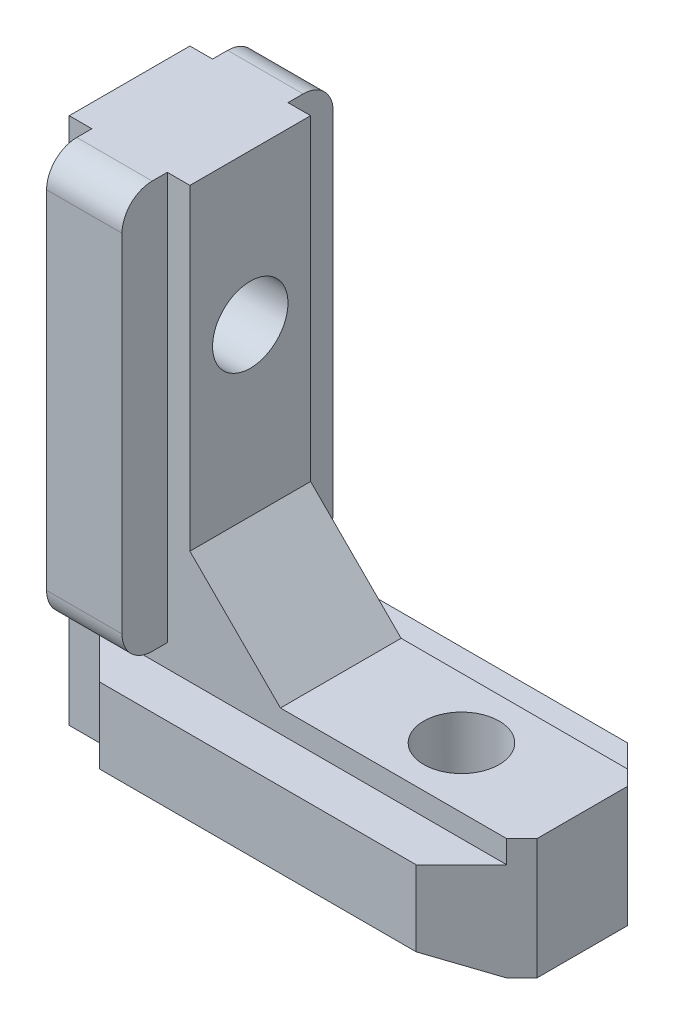
ISO-10303-21;
HEADER;
FILE_DESCRIPTION(('STEP AP214'),'2;1');
FILE_NAME('part.step','',(''),(''),'','','');
FILE_SCHEMA(('AUTOMOTIVE_DESIGN { 1 0 10303 214 1 1 1 1 }'));
ENDSEC;
DATA;
#1=APPLICATION_CONTEXT('core data for automotive mechanical design processes');
#2=APPLICATION_PROTOCOL_DEFINITION('international standard','automotive_design',2000,#1);
#3=PRODUCT_CONTEXT('',#1,'mechanical');
#4=PRODUCT('Part','Part','',(#3));
#5=PRODUCT_RELATED_PRODUCT_CATEGORY('part','',(#4));
#6=PRODUCT_DEFINITION_FORMATION('','',#4);
#7=PRODUCT_DEFINITION_CONTEXT('part definition',#1,'design');
#8=PRODUCT_DEFINITION('design','',#6,#7);
#9=PRODUCT_DEFINITION_SHAPE('','',#8);
#10=(LENGTH_UNIT() NAMED_UNIT(*) SI_UNIT(.MILLI.,.METRE.));
#11=(NAMED_UNIT(*) PLANE_ANGLE_UNIT() SI_UNIT($,.RADIAN.));
#12=(NAMED_UNIT(*) SI_UNIT($,.STERADIAN.) SOLID_ANGLE_UNIT());
#13=UNCERTAINTY_MEASURE_WITH_UNIT(LENGTH_MEASURE(1.E-05),#10,'distance_accuracy_value','');
#14=(GEOMETRIC_REPRESENTATION_CONTEXT(3) GLOBAL_UNCERTAINTY_ASSIGNED_CONTEXT((#13)) GLOBAL_UNIT_ASSIGNED_CONTEXT((#10,
#11,#12)) REPRESENTATION_CONTEXT('',''));
#15=CARTESIAN_POINT('',(0.,0.,0.));
#16=DIRECTION('',(0.,0.,1.));
#17=DIRECTION('',(1.,0.,0.));
#18=AXIS2_PLACEMENT_3D('',#15,#16,#17);
#19=CARTESIAN_POINT('',(30.,0.,4.));
#20=DIRECTION('',(0.,1.,0.));
#21=DIRECTION('',(-1.,0.,0.));
#22=AXIS2_PLACEMENT_3D('',#19,#20,#21);
#23=PLANE('',#22);
#24=CARTESIAN_POINT('',(22.,0.,0.));
#25=DIRECTION('',(0.,-1.,0.));
#26=DIRECTION('',(1.,0.,0.));
#27=AXIS2_PLACEMENT_3D('',#24,#25,#26);
#28=CIRCLE('',#27,2.5);
#29=CARTESIAN_POINT('',(24.5,0.,0.));
#30=VERTEX_POINT('',#29);
#31=EDGE_CURVE('E295',#30,#30,#28,.T.);
#32=ORIENTED_EDGE('',*,*,#31,.F.);
#33=EDGE_LOOP('',(#32));
#34=FACE_BOUND('',#33,.T.);
#35=DIRECTION('',(1.,0.,0.));
#36=VECTOR('',#35,1.);
#37=CARTESIAN_POINT('',(0.999999999999997,0.,-4.));
#38=LINE('',#37,#36);
#39=CARTESIAN_POINT('',(2.00000000000004,0.,-4.));
#40=VERTEX_POINT('',#39);
#41=CARTESIAN_POINT('',(29.,0.,-4.));
#42=VERTEX_POINT('',#41);
#43=EDGE_CURVE('E302',#40,#42,#38,.T.);
#44=ORIENTED_EDGE('',*,*,#43,.T.);
#45=DIRECTION('',(0.707106781186549,0.,0.707106781186546));
#46=VECTOR('',#45,1.);
#47=CARTESIAN_POINT('',(30.,0.,-3.));
#48=LINE('',#47,#46);
#49=CARTESIAN_POINT('',(30.,0.,-3.));
#50=VERTEX_POINT('',#49);
#51=EDGE_CURVE('E400',#42,#50,#48,.T.);
#52=ORIENTED_EDGE('',*,*,#51,.T.);
#53=DIRECTION('',(0.,0.,-1.));
#54=VECTOR('',#53,1.);
#55=CARTESIAN_POINT('',(30.,0.,4.));
#56=LINE('',#55,#54);
#57=CARTESIAN_POINT('',(30.,0.,3.));
#58=VERTEX_POINT('',#57);
#59=EDGE_CURVE('E356',#58,#50,#56,.T.);
#60=ORIENTED_EDGE('',*,*,#59,.F.);
#61=DIRECTION('',(-0.707106781186549,0.,0.707106781186546));
#62=VECTOR('',#61,1.);
#63=CARTESIAN_POINT('',(30.,0.,3.));
#64=LINE('',#63,#62);
#65=CARTESIAN_POINT('',(29.,0.,4.));
#66=VERTEX_POINT('',#65);
#67=EDGE_CURVE('E398',#58,#66,#64,.T.);
#68=ORIENTED_EDGE('',*,*,#67,.T.);
#69=DIRECTION('',(1.,0.,0.));
#70=VECTOR('',#69,1.);
#71=CARTESIAN_POINT('',(0.999999999999997,0.,4.));
#72=LINE('',#71,#70);
#73=CARTESIAN_POINT('',(2.00000000000003,0.,4.));
#74=VERTEX_POINT('',#73);
#75=EDGE_CURVE('E314',#74,#66,#72,.T.);
#76=ORIENTED_EDGE('',*,*,#75,.F.);
#77=DIRECTION('',(1.,0.,0.));
#78=VECTOR('',#77,1.);
#79=CARTESIAN_POINT('',(30.,0.,4.));
#80=LINE('',#79,#78);
#81=CARTESIAN_POINT('',(0.,0.,4.));
#82=VERTEX_POINT('',#81);
#83=EDGE_CURVE('E326',#82,#74,#80,.T.);
#84=ORIENTED_EDGE('',*,*,#83,.F.);
#85=DIRECTION('',(0.,0.,-1.));
#86=VECTOR('',#85,1.);
#87=CARTESIAN_POINT('',(0.,0.,4.));
#88=LINE('',#87,#86);
#89=CARTESIAN_POINT('',(0.,0.,-4.));
#90=VERTEX_POINT('',#89);
#91=EDGE_CURVE('E335',#82,#90,#88,.T.);
#92=ORIENTED_EDGE('',*,*,#91,.T.);
#93=DIRECTION('',(1.,0.,0.));
#94=VECTOR('',#93,1.);
#95=CARTESIAN_POINT('',(30.,0.,-4.));
#96=LINE('',#95,#94);
#97=EDGE_CURVE('E317',#90,#40,#96,.T.);
#98=ORIENTED_EDGE('',*,*,#97,.T.);
#99=EDGE_LOOP('',(#44,#52,#60,#68,#76,#84,#92,#98));
#100=FACE_BOUND('',#99,.T.);
#101=ADVANCED_FACE('F39',(#34,#100),#23,.F.);
#102=CARTESIAN_POINT('',(30.,8.,4.));
#103=DIRECTION('',(-1.,0.,0.));
#104=DIRECTION('',(0.,0.,1.));
#105=AXIS2_PLACEMENT_3D('',#102,#103,#104);
#106=PLANE('',#105);
#107=ORIENTED_EDGE('',*,*,#59,.T.);
#108=DIRECTION('',(0.,1.,0.));
#109=VECTOR('',#108,1.);
#110=CARTESIAN_POINT('',(30.,6.5,-3.));
#111=LINE('',#110,#109);
#112=CARTESIAN_POINT('',(30.,8.,-3.));
#113=VERTEX_POINT('',#112);
#114=EDGE_CURVE('E389',#50,#113,#111,.T.);
#115=ORIENTED_EDGE('',*,*,#114,.T.);
#116=DIRECTION('',(0.,0.,-1.));
#117=VECTOR('',#116,1.);
#118=CARTESIAN_POINT('',(30.,8.,4.));
#119=LINE('',#118,#117);
#120=CARTESIAN_POINT('',(30.,8.,3.));
#121=VERTEX_POINT('',#120);
#122=EDGE_CURVE('E353',#121,#113,#119,.T.);
#123=ORIENTED_EDGE('',*,*,#122,.F.);
#124=DIRECTION('',(0.,-1.,0.));
#125=VECTOR('',#124,1.);
#126=CARTESIAN_POINT('',(30.,1.5,3.));
#127=LINE('',#126,#125);
#128=EDGE_CURVE('E386',#121,#58,#127,.T.);
#129=ORIENTED_EDGE('',*,*,#128,.T.);
#130=EDGE_LOOP('',(#107,#115,#123,#129));
#131=FACE_BOUND('',#130,.T.);
#132=ADVANCED_FACE('F469',(#131),#106,.F.);
#133=CARTESIAN_POINT('',(8.,8.,4.));
#134=DIRECTION('',(0.,-1.,0.));
#135=DIRECTION('',(0.,0.,-1.));
#136=AXIS2_PLACEMENT_3D('',#133,#134,#135);
#137=PLANE('',#136);
#138=CARTESIAN_POINT('',(22.,8.,0.));
#139=DIRECTION('',(0.,-1.,0.));
#140=DIRECTION('',(0.,0.,-1.));
#141=AXIS2_PLACEMENT_3D('',#138,#139,#140);
#142=CIRCLE('',#141,2.5);
#143=CARTESIAN_POINT('',(22.,8.,-2.5));
#144=VERTEX_POINT('',#143);
#145=EDGE_CURVE('E298',#144,#144,#142,.F.);
#146=ORIENTED_EDGE('',*,*,#145,.F.);
#147=EDGE_LOOP('',(#146));
#148=FACE_BOUND('',#147,.T.);
#149=DIRECTION('',(-1.,0.,0.));
#150=VECTOR('',#149,1.);
#151=CARTESIAN_POINT('',(8.,8.,-4.));
#152=LINE('',#151,#150);
#153=CARTESIAN_POINT('',(29.,8.,-4.));
#154=VERTEX_POINT('',#153);
#155=CARTESIAN_POINT('',(14.,8.,-4.));
#156=VERTEX_POINT('',#155);
#157=EDGE_CURVE('E337',#154,#156,#152,.T.);
#158=ORIENTED_EDGE('',*,*,#157,.T.);
#159=DIRECTION('',(0.,0.,1.));
#160=VECTOR('',#159,1.);
#161=CARTESIAN_POINT('',(14.,8.,4.));
#162=LINE('',#161,#160);
#163=CARTESIAN_POINT('',(14.,8.,4.));
#164=VERTEX_POINT('',#163);
#165=EDGE_CURVE('E412',#156,#164,#162,.T.);
#166=ORIENTED_EDGE('',*,*,#165,.T.);
#167=DIRECTION('',(-1.,0.,0.));
#168=VECTOR('',#167,1.);
#169=CARTESIAN_POINT('',(8.,8.,4.));
#170=LINE('',#169,#168);
#171=CARTESIAN_POINT('',(29.,8.,4.));
#172=VERTEX_POINT('',#171);
#173=EDGE_CURVE('E328',#172,#164,#170,.T.);
#174=ORIENTED_EDGE('',*,*,#173,.F.);
#175=DIRECTION('',(0.707106781186549,0.,-0.707106781186546));
#176=VECTOR('',#175,1.);
#177=CARTESIAN_POINT('',(30.,8.,3.));
#178=LINE('',#177,#176);
#179=EDGE_CURVE('E392',#172,#121,#178,.T.);
#180=ORIENTED_EDGE('',*,*,#179,.T.);
#181=ORIENTED_EDGE('',*,*,#122,.T.);
#182=DIRECTION('',(-0.707106781186549,0.,-0.707106781186546));
#183=VECTOR('',#182,1.);
#184=CARTESIAN_POINT('',(30.,8.,-3.));
#185=LINE('',#184,#183);
#186=EDGE_CURVE('E394',#113,#154,#185,.T.);
#187=ORIENTED_EDGE('',*,*,#186,.T.);
#188=EDGE_LOOP('',(#158,#166,#174,#180,#181,#187));
#189=FACE_BOUND('',#188,.T.);
#190=ADVANCED_FACE('F475',(#148,#189),#137,.F.);
#191=CARTESIAN_POINT('',(8.,35.,4.));
#192=DIRECTION('',(-1.,0.,0.));
#193=DIRECTION('',(0.,-1.,0.));
#194=AXIS2_PLACEMENT_3D('',#191,#192,#193);
#195=PLANE('',#194);
#196=CARTESIAN_POINT('',(8.,25.,0.));
#197=DIRECTION('',(-1.,0.,0.));
#198=DIRECTION('',(0.,-1.,0.));
#199=AXIS2_PLACEMENT_3D('',#196,#197,#198);
#200=CIRCLE('',#199,2.5);
#201=CARTESIAN_POINT('',(8.,22.5,0.));
#202=VERTEX_POINT('',#201);
#203=EDGE_CURVE('E292',#202,#202,#200,.F.);
#204=ORIENTED_EDGE('',*,*,#203,.F.);
#205=EDGE_LOOP('',(#204));
#206=FACE_BOUND('',#205,.T.);
#207=DIRECTION('',(0.,1.,0.));
#208=VECTOR('',#207,1.);
#209=CARTESIAN_POINT('',(8.,35.,4.));
#210=LINE('',#209,#208);
#211=CARTESIAN_POINT('',(8.,14.,4.));
#212=VERTEX_POINT('',#211);
#213=CARTESIAN_POINT('',(8.,35.,4.));
#214=VERTEX_POINT('',#213);
#215=EDGE_CURVE('E239',#212,#214,#210,.T.);
#216=ORIENTED_EDGE('',*,*,#215,.F.);
#217=DIRECTION('',(0.,0.,-1.));
#218=VECTOR('',#217,1.);
#219=CARTESIAN_POINT('',(8.,14.,-4.));
#220=LINE('',#219,#218);
#221=CARTESIAN_POINT('',(8.,14.,-4.));
#222=VERTEX_POINT('',#221);
#223=EDGE_CURVE('E409',#212,#222,#220,.T.);
#224=ORIENTED_EDGE('',*,*,#223,.T.);
#225=DIRECTION('',(0.,1.,0.));
#226=VECTOR('',#225,1.);
#227=CARTESIAN_POINT('',(8.,35.,-4.));
#228=LINE('',#227,#226);
#229=CARTESIAN_POINT('',(8.,35.,-4.));
#230=VERTEX_POINT('',#229);
#231=EDGE_CURVE('E340',#222,#230,#228,.T.);
#232=ORIENTED_EDGE('',*,*,#231,.T.);
#233=DIRECTION('',(0.,0.,-1.));
#234=VECTOR('',#233,1.);
#235=CARTESIAN_POINT('',(8.,35.,4.));
#236=LINE('',#235,#234);
#237=EDGE_CURVE('E350',#214,#230,#236,.T.);
#238=ORIENTED_EDGE('',*,*,#237,.F.);
#239=EDGE_LOOP('',(#216,#224,#232,#238));
#240=FACE_BOUND('',#239,.T.);
#241=ADVANCED_FACE('F618',(#206,#240),#195,.F.);
#242=CARTESIAN_POINT('',(0.,35.,4.));
#243=DIRECTION('',(0.,-1.,0.));
#244=DIRECTION('',(0.,0.,-1.));
#245=AXIS2_PLACEMENT_3D('',#242,#243,#244);
#246=PLANE('',#245);
#247=DIRECTION('',(0.,0.,-1.));
#248=VECTOR('',#247,1.);
#249=CARTESIAN_POINT('',(6.5,35.,-7.));
#250=LINE('',#249,#248);
#251=CARTESIAN_POINT('',(6.5,35.,-4.));
#252=VERTEX_POINT('',#251);
#253=CARTESIAN_POINT('',(6.5,35.,-5.));
#254=VERTEX_POINT('',#253);
#255=EDGE_CURVE('E261',#252,#254,#250,.T.);
#256=ORIENTED_EDGE('',*,*,#255,.T.);
#257=DIRECTION('',(-1.,0.,0.));
#258=VECTOR('',#257,1.);
#259=CARTESIAN_POINT('',(1.5,35.,-5.));
#260=LINE('',#259,#258);
#261=CARTESIAN_POINT('',(1.5,35.,-5.));
#262=VERTEX_POINT('',#261);
#263=EDGE_CURVE('E11',#254,#262,#260,.T.);
#264=ORIENTED_EDGE('',*,*,#263,.T.);
#265=DIRECTION('',(0.,0.,1.));
#266=VECTOR('',#265,1.);
#267=CARTESIAN_POINT('',(1.5,35.,-4.));
#268=LINE('',#267,#266);
#269=CARTESIAN_POINT('',(1.5,35.,-4.));
#270=VERTEX_POINT('',#269);
#271=EDGE_CURVE('E270',#262,#270,#268,.T.);
#272=ORIENTED_EDGE('',*,*,#271,.T.);
#273=DIRECTION('',(-1.,0.,0.));
#274=VECTOR('',#273,1.);
#275=CARTESIAN_POINT('',(0.,35.,-4.));
#276=LINE('',#275,#274);
#277=CARTESIAN_POINT('',(0.,35.,-4.));
#278=VERTEX_POINT('',#277);
#279=EDGE_CURVE('E342',#270,#278,#276,.T.);
#280=ORIENTED_EDGE('',*,*,#279,.T.);
#281=DIRECTION('',(0.,0.,-1.));
#282=VECTOR('',#281,1.);
#283=CARTESIAN_POINT('',(0.,35.,4.));
#284=LINE('',#283,#282);
#285=CARTESIAN_POINT('',(0.,35.,4.));
#286=VERTEX_POINT('',#285);
#287=EDGE_CURVE('E235',#286,#278,#284,.T.);
#288=ORIENTED_EDGE('',*,*,#287,.F.);
#289=DIRECTION('',(-1.,0.,0.));
#290=VECTOR('',#289,1.);
#291=CARTESIAN_POINT('',(0.,35.,4.));
#292=LINE('',#291,#290);
#293=CARTESIAN_POINT('',(1.5,35.,4.));
#294=VERTEX_POINT('',#293);
#295=EDGE_CURVE('E227',#294,#286,#292,.T.);
#296=ORIENTED_EDGE('',*,*,#295,.F.);
#297=DIRECTION('',(0.,0.,1.));
#298=VECTOR('',#297,1.);
#299=CARTESIAN_POINT('',(1.5,35.,7.));
#300=LINE('',#299,#298);
#301=CARTESIAN_POINT('',(1.5,35.,5.));
#302=VERTEX_POINT('',#301);
#303=EDGE_CURVE('E232',#294,#302,#300,.T.);
#304=ORIENTED_EDGE('',*,*,#303,.T.);
#305=DIRECTION('',(1.,0.,0.));
#306=VECTOR('',#305,1.);
#307=CARTESIAN_POINT('',(6.5,35.,5.));
#308=LINE('',#307,#306);
#309=CARTESIAN_POINT('',(6.5,35.,5.));
#310=VERTEX_POINT('',#309);
#311=EDGE_CURVE('E47',#302,#310,#308,.T.);
#312=ORIENTED_EDGE('',*,*,#311,.T.);
#313=DIRECTION('',(0.,0.,-1.));
#314=VECTOR('',#313,1.);
#315=CARTESIAN_POINT('',(6.5,35.,4.));
#316=LINE('',#315,#314);
#317=CARTESIAN_POINT('',(6.5,35.,4.));
#318=VERTEX_POINT('',#317);
#319=EDGE_CURVE('E252',#310,#318,#316,.T.);
#320=ORIENTED_EDGE('',*,*,#319,.T.);
#321=EDGE_CURVE('E238',#214,#318,#292,.T.);
#322=ORIENTED_EDGE('',*,*,#321,.F.);
#323=ORIENTED_EDGE('',*,*,#237,.T.);
#324=EDGE_CURVE('E343',#230,#252,#276,.T.);
#325=ORIENTED_EDGE('',*,*,#324,.T.);
#326=EDGE_LOOP('',(#256,#264,#272,#280,#288,#296,#304,#312,#320,#322,#323,#325));
#327=FACE_BOUND('',#326,.T.);
#328=ADVANCED_FACE('F230',(#327),#246,.F.);
#329=CARTESIAN_POINT('',(0.,0.,4.));
#330=DIRECTION('',(1.,0.,0.));
#331=DIRECTION('',(0.,0.,-1.));
#332=AXIS2_PLACEMENT_3D('',#329,#330,#331);
#333=PLANE('',#332);
#334=CARTESIAN_POINT('',(0.,25.,0.));
#335=DIRECTION('',(-1.,0.,0.));
#336=DIRECTION('',(0.,0.,1.));
#337=AXIS2_PLACEMENT_3D('',#334,#335,#336);
#338=CIRCLE('',#337,2.5);
#339=CARTESIAN_POINT('',(0.,25.,2.5));
#340=VERTEX_POINT('',#339);
#341=EDGE_CURVE('E281',#340,#340,#338,.T.);
#342=ORIENTED_EDGE('',*,*,#341,.F.);
#343=EDGE_LOOP('',(#342));
#344=FACE_BOUND('',#343,.T.);
#345=DIRECTION('',(0.,-1.,0.));
#346=VECTOR('',#345,1.);
#347=CARTESIAN_POINT('',(0.,0.,-4.));
#348=LINE('',#347,#346);
#349=EDGE_CURVE('E329',#278,#90,#348,.T.);
#350=ORIENTED_EDGE('',*,*,#349,.T.);
#351=ORIENTED_EDGE('',*,*,#91,.F.);
#352=DIRECTION('',(0.,-1.,0.));
#353=VECTOR('',#352,1.);
#354=CARTESIAN_POINT('',(0.,0.,4.));
#355=LINE('',#354,#353);
#356=EDGE_CURVE('E333',#286,#82,#355,.T.);
#357=ORIENTED_EDGE('',*,*,#356,.F.);
#358=ORIENTED_EDGE('',*,*,#287,.T.);
#359=EDGE_LOOP('',(#350,#351,#357,#358));
#360=FACE_BOUND('',#359,.T.);
#361=ADVANCED_FACE('F617',(#344,#360),#333,.F.);
#362=CARTESIAN_POINT('',(0.,0.,4.));
#363=DIRECTION('',(0.,0.,-1.));
#364=DIRECTION('',(-1.,0.,0.));
#365=AXIS2_PLACEMENT_3D('',#362,#363,#364);
#366=PLANE('',#365);
#367=ORIENTED_EDGE('',*,*,#321,.T.);
#368=DIRECTION('',(0.,1.,0.));
#369=VECTOR('',#368,1.);
#370=CARTESIAN_POINT('',(6.5,8.,4.));
#371=LINE('',#370,#369);
#372=CARTESIAN_POINT('',(6.5,8.,4.));
#373=VERTEX_POINT('',#372);
#374=EDGE_CURVE('E258',#373,#318,#371,.T.);
#375=ORIENTED_EDGE('',*,*,#374,.F.);
#376=DIRECTION('',(-1.,0.,0.));
#377=VECTOR('',#376,1.);
#378=CARTESIAN_POINT('',(1.5,8.,4.));
#379=LINE('',#378,#377);
#380=CARTESIAN_POINT('',(1.5,8.,4.));
#381=VERTEX_POINT('',#380);
#382=EDGE_CURVE('E247',#373,#381,#379,.T.);
#383=ORIENTED_EDGE('',*,*,#382,.T.);
#384=DIRECTION('',(0.,1.,0.));
#385=VECTOR('',#384,1.);
#386=CARTESIAN_POINT('',(1.5,8.,4.));
#387=LINE('',#386,#385);
#388=EDGE_CURVE('E242',#381,#294,#387,.T.);
#389=ORIENTED_EDGE('',*,*,#388,.T.);
#390=ORIENTED_EDGE('',*,*,#295,.T.);
#391=ORIENTED_EDGE('',*,*,#356,.T.);
#392=ORIENTED_EDGE('',*,*,#83,.T.);
#393=DIRECTION('',(0.,1.,0.));
#394=VECTOR('',#393,1.);
#395=CARTESIAN_POINT('',(2.00000000000003,0.,4.));
#396=LINE('',#395,#394);
#397=CARTESIAN_POINT('',(2.00000000000003,6.5,4.));
#398=VERTEX_POINT('',#397);
#399=EDGE_CURVE('E407',#74,#398,#396,.T.);
#400=ORIENTED_EDGE('',*,*,#399,.T.);
#401=DIRECTION('',(1.,0.,0.));
#402=VECTOR('',#401,1.);
#403=CARTESIAN_POINT('',(0.999999999999997,6.5,4.));
#404=LINE('',#403,#402);
#405=CARTESIAN_POINT('',(29.,6.5,4.));
#406=VERTEX_POINT('',#405);
#407=EDGE_CURVE('E305',#398,#406,#404,.T.);
#408=ORIENTED_EDGE('',*,*,#407,.T.);
#409=DIRECTION('',(0.,1.,0.));
#410=VECTOR('',#409,1.);
#411=CARTESIAN_POINT('',(29.,8.,4.));
#412=LINE('',#411,#410);
#413=EDGE_CURVE('E402',#406,#172,#412,.T.);
#414=ORIENTED_EDGE('',*,*,#413,.T.);
#415=ORIENTED_EDGE('',*,*,#173,.T.);
#416=DIRECTION('',(0.707106781186544,-0.707106781186551,0.));
#417=VECTOR('',#416,1.);
#418=CARTESIAN_POINT('',(11.0000000000001,11.,4.));
#419=LINE('',#418,#417);
#420=EDGE_CURVE('E416',#164,#212,#419,.F.);
#421=ORIENTED_EDGE('',*,*,#420,.T.);
#422=ORIENTED_EDGE('',*,*,#215,.T.);
#423=EDGE_LOOP('',(#367,#375,#383,#389,#390,#391,#392,#400,#408,#414,#415,#421,#422));
#424=FACE_BOUND('',#423,.T.);
#425=ADVANCED_FACE('F244',(#424),#366,.F.);
#426=CARTESIAN_POINT('',(0.,0.,-4.));
#427=DIRECTION('',(0.,0.,-1.));
#428=DIRECTION('',(-1.,0.,0.));
#429=AXIS2_PLACEMENT_3D('',#426,#427,#428);
#430=PLANE('',#429);
#431=DIRECTION('',(0.,1.,0.));
#432=VECTOR('',#431,1.);
#433=CARTESIAN_POINT('',(1.5,8.,-4.));
#434=LINE('',#433,#432);
#435=CARTESIAN_POINT('',(1.5,8.,-4.));
#436=VERTEX_POINT('',#435);
#437=EDGE_CURVE('E278',#436,#270,#434,.T.);
#438=ORIENTED_EDGE('',*,*,#437,.F.);
#439=DIRECTION('',(1.,0.,0.));
#440=VECTOR('',#439,1.);
#441=CARTESIAN_POINT('',(1.5,8.,-4.));
#442=LINE('',#441,#440);
#443=CARTESIAN_POINT('',(6.5,8.,-4.));
#444=VERTEX_POINT('',#443);
#445=EDGE_CURVE('E266',#436,#444,#442,.T.);
#446=ORIENTED_EDGE('',*,*,#445,.T.);
#447=DIRECTION('',(0.,1.,0.));
#448=VECTOR('',#447,1.);
#449=CARTESIAN_POINT('',(6.5,8.,-4.));
#450=LINE('',#449,#448);
#451=EDGE_CURVE('E275',#444,#252,#450,.T.);
#452=ORIENTED_EDGE('',*,*,#451,.T.);
#453=ORIENTED_EDGE('',*,*,#324,.F.);
#454=ORIENTED_EDGE('',*,*,#231,.F.);
#455=DIRECTION('',(-0.707106781186544,0.707106781186551,0.));
#456=VECTOR('',#455,1.);
#457=CARTESIAN_POINT('',(8.,14.,-4.));
#458=LINE('',#457,#456);
#459=EDGE_CURVE('E414',#222,#156,#458,.F.);
#460=ORIENTED_EDGE('',*,*,#459,.T.);
#461=ORIENTED_EDGE('',*,*,#157,.F.);
#462=DIRECTION('',(0.,-1.,0.));
#463=VECTOR('',#462,1.);
#464=CARTESIAN_POINT('',(29.,0.,-4.));
#465=LINE('',#464,#463);
#466=CARTESIAN_POINT('',(29.,6.5,-4.));
#467=VERTEX_POINT('',#466);
#468=EDGE_CURVE('E396',#154,#467,#465,.T.);
#469=ORIENTED_EDGE('',*,*,#468,.T.);
#470=DIRECTION('',(1.,0.,0.));
#471=VECTOR('',#470,1.);
#472=CARTESIAN_POINT('',(0.999999999999997,6.5,-4.));
#473=LINE('',#472,#471);
#474=CARTESIAN_POINT('',(2.00000000000003,6.5,-4.));
#475=VERTEX_POINT('',#474);
#476=EDGE_CURVE('E306',#475,#467,#473,.T.);
#477=ORIENTED_EDGE('',*,*,#476,.F.);
#478=DIRECTION('',(0.,1.,0.));
#479=VECTOR('',#478,1.);
#480=CARTESIAN_POINT('',(2.00000000000003,6.5,-4.));
#481=LINE('',#480,#479);
#482=EDGE_CURVE('E404',#475,#40,#481,.F.);
#483=ORIENTED_EDGE('',*,*,#482,.T.);
#484=ORIENTED_EDGE('',*,*,#97,.F.);
#485=ORIENTED_EDGE('',*,*,#349,.F.);
#486=ORIENTED_EDGE('',*,*,#279,.F.);
#487=EDGE_LOOP('',(#438,#446,#452,#453,#454,#460,#461,#469,#477,#483,#484,#485,#486));
#488=FACE_BOUND('',#487,.T.);
#489=ADVANCED_FACE('F629',(#488),#430,.T.);
#490=CARTESIAN_POINT('',(0.999999999999997,1.5,7.));
#491=DIRECTION('',(0.,-0.894427190999916,0.447213595499958));
#492=DIRECTION('',(0.,-0.447213595499958,-0.894427190999916));
#493=AXIS2_PLACEMENT_3D('',#490,#491,#492);
#494=PLANE('',#493);
#495=DIRECTION('',(1.,0.,0.));
#496=VECTOR('',#495,1.);
#497=CARTESIAN_POINT('',(0.999999999999997,1.5,7.));
#498=LINE('',#497,#496);
#499=CARTESIAN_POINT('',(5.00000000000007,1.5,7.));
#500=VERTEX_POINT('',#499);
#501=CARTESIAN_POINT('',(26.,1.5,7.));
#502=VERTEX_POINT('',#501);
#503=EDGE_CURVE('E318',#500,#502,#498,.T.);
#504=ORIENTED_EDGE('',*,*,#503,.F.);
#505=DIRECTION('',(-0.666666666666671,-0.333333333333332,-0.666666666666663));
#506=VECTOR('',#505,1.);
#507=CARTESIAN_POINT('',(3.22222222222224,0.611111111111094,5.22222222222219));
#508=LINE('',#507,#506);
#509=EDGE_CURVE('E379',#500,#74,#508,.T.);
#510=ORIENTED_EDGE('',*,*,#509,.T.);
#511=ORIENTED_EDGE('',*,*,#75,.T.);
#512=DIRECTION('',(-0.666666666666668,0.333333333333333,0.666666666666665));
#513=VECTOR('',#512,1.);
#514=CARTESIAN_POINT('',(14.8888888888888,7.05555555555556,18.1111111111111));
#515=LINE('',#514,#513);
#516=EDGE_CURVE('E377',#66,#502,#515,.T.);
#517=ORIENTED_EDGE('',*,*,#516,.T.);
#518=EDGE_LOOP('',(#504,#510,#511,#517));
#519=FACE_BOUND('',#518,.T.);
#520=ADVANCED_FACE('F634',(#519),#494,.T.);
#521=CARTESIAN_POINT('',(0.999999999999997,6.5,7.));
#522=DIRECTION('',(0.,0.,1.));
#523=DIRECTION('',(1.,0.,0.));
#524=AXIS2_PLACEMENT_3D('',#521,#522,#523);
#525=PLANE('',#524);
#526=DIRECTION('',(1.,0.,0.));
#527=VECTOR('',#526,1.);
#528=CARTESIAN_POINT('',(0.999999999999997,6.5,7.));
#529=LINE('',#528,#527);
#530=CARTESIAN_POINT('',(5.00000000000007,6.5,7.));
#531=VERTEX_POINT('',#530);
#532=CARTESIAN_POINT('',(26.,6.5,7.));
#533=VERTEX_POINT('',#532);
#534=EDGE_CURVE('E321',#531,#533,#529,.T.);
#535=ORIENTED_EDGE('',*,*,#534,.F.);
#536=DIRECTION('',(0.,-1.,0.));
#537=VECTOR('',#536,1.);
#538=CARTESIAN_POINT('',(5.00000000000007,1.5,7.));
#539=LINE('',#538,#537);
#540=EDGE_CURVE('E374',#531,#500,#539,.T.);
#541=ORIENTED_EDGE('',*,*,#540,.T.);
#542=ORIENTED_EDGE('',*,*,#503,.T.);
#543=DIRECTION('',(0.,1.,0.));
#544=VECTOR('',#543,1.);
#545=CARTESIAN_POINT('',(26.,6.5,7.));
#546=LINE('',#545,#544);
#547=EDGE_CURVE('E372',#502,#533,#546,.T.);
#548=ORIENTED_EDGE('',*,*,#547,.T.);
#549=EDGE_LOOP('',(#535,#541,#542,#548));
#550=FACE_BOUND('',#549,.T.);
#551=ADVANCED_FACE('F760',(#550),#525,.T.);
#552=CARTESIAN_POINT('',(0.999999999999997,6.5,4.));
#553=DIRECTION('',(0.,1.,0.));
#554=DIRECTION('',(0.,0.,1.));
#555=AXIS2_PLACEMENT_3D('',#552,#553,#554);
#556=PLANE('',#555);
#557=ORIENTED_EDGE('',*,*,#407,.F.);
#558=DIRECTION('',(0.707106781186551,0.,0.707106781186544));
#559=VECTOR('',#558,1.);
#560=CARTESIAN_POINT('',(1.50000000000001,6.5,3.49999999999998));
#561=LINE('',#560,#559);
#562=EDGE_CURVE('E384',#398,#531,#561,.T.);
#563=ORIENTED_EDGE('',*,*,#562,.T.);
#564=ORIENTED_EDGE('',*,*,#534,.T.);
#565=DIRECTION('',(0.707106781186549,0.,-0.707106781186546));
#566=VECTOR('',#565,1.);
#567=CARTESIAN_POINT('',(14.9999999999999,6.5,18.));
#568=LINE('',#567,#566);
#569=EDGE_CURVE('E382',#533,#406,#568,.T.);
#570=ORIENTED_EDGE('',*,*,#569,.T.);
#571=EDGE_LOOP('',(#557,#563,#564,#570));
#572=FACE_BOUND('',#571,.T.);
#573=ADVANCED_FACE('F750',(#572),#556,.T.);
#574=CARTESIAN_POINT('',(0.999999999999997,1.5,-7.));
#575=DIRECTION('',(0.,-0.894427190999916,-0.447213595499958));
#576=DIRECTION('',(0.,0.447213595499958,-0.894427190999916));
#577=AXIS2_PLACEMENT_3D('',#574,#575,#576);
#578=PLANE('',#577);
#579=ORIENTED_EDGE('',*,*,#43,.F.);
#580=DIRECTION('',(-0.666666666666671,-0.333333333333332,0.666666666666663));
#581=VECTOR('',#580,1.);
#582=CARTESIAN_POINT('',(3.22222222222224,0.611111111111094,-5.22222222222219));
#583=LINE('',#582,#581);
#584=CARTESIAN_POINT('',(5.00000000000007,1.5,-7.));
#585=VERTEX_POINT('',#584);
#586=EDGE_CURVE('E370',#40,#585,#583,.F.);
#587=ORIENTED_EDGE('',*,*,#586,.T.);
#588=DIRECTION('',(1.,0.,0.));
#589=VECTOR('',#588,1.);
#590=CARTESIAN_POINT('',(0.999999999999997,1.5,-7.));
#591=LINE('',#590,#589);
#592=CARTESIAN_POINT('',(26.,1.5,-7.));
#593=VERTEX_POINT('',#592);
#594=EDGE_CURVE('E301',#585,#593,#591,.T.);
#595=ORIENTED_EDGE('',*,*,#594,.T.);
#596=DIRECTION('',(0.666666666666668,-0.333333333333333,0.666666666666665));
#597=VECTOR('',#596,1.);
#598=CARTESIAN_POINT('',(14.8888888888888,7.05555555555556,-18.1111111111111));
#599=LINE('',#598,#597);
#600=EDGE_CURVE('E368',#593,#42,#599,.T.);
#601=ORIENTED_EDGE('',*,*,#600,.T.);
#602=EDGE_LOOP('',(#579,#587,#595,#601));
#603=FACE_BOUND('',#602,.T.);
#604=ADVANCED_FACE('F740',(#603),#578,.T.);
#605=CARTESIAN_POINT('',(0.999999999999997,6.5,-4.));
#606=DIRECTION('',(0.,1.,0.));
#607=DIRECTION('',(0.,0.,1.));
#608=AXIS2_PLACEMENT_3D('',#605,#606,#607);
#609=PLANE('',#608);
#610=DIRECTION('',(1.,0.,0.));
#611=VECTOR('',#610,1.);
#612=CARTESIAN_POINT('',(0.999999999999997,6.5,-7.));
#613=LINE('',#612,#611);
#614=CARTESIAN_POINT('',(5.00000000000007,6.5,-7.));
#615=VERTEX_POINT('',#614);
#616=CARTESIAN_POINT('',(26.,6.5,-7.));
#617=VERTEX_POINT('',#616);
#618=EDGE_CURVE('E309',#615,#617,#613,.T.);
#619=ORIENTED_EDGE('',*,*,#618,.F.);
#620=DIRECTION('',(0.707106781186551,0.,-0.707106781186544));
#621=VECTOR('',#620,1.);
#622=CARTESIAN_POINT('',(1.50000000000001,6.5,-3.49999999999998));
#623=LINE('',#622,#621);
#624=EDGE_CURVE('E366',#615,#475,#623,.F.);
#625=ORIENTED_EDGE('',*,*,#624,.T.);
#626=ORIENTED_EDGE('',*,*,#476,.T.);
#627=DIRECTION('',(-0.707106781186549,0.,-0.707106781186546));
#628=VECTOR('',#627,1.);
#629=CARTESIAN_POINT('',(14.9999999999999,6.5,-18.));
#630=LINE('',#629,#628);
#631=EDGE_CURVE('E364',#467,#617,#630,.T.);
#632=ORIENTED_EDGE('',*,*,#631,.T.);
#633=EDGE_LOOP('',(#619,#625,#626,#632));
#634=FACE_BOUND('',#633,.T.);
#635=ADVANCED_FACE('F730',(#634),#609,.T.);
#636=CARTESIAN_POINT('',(0.999999999999997,6.5,-7.));
#637=DIRECTION('',(0.,0.,-1.));
#638=DIRECTION('',(-1.,0.,0.));
#639=AXIS2_PLACEMENT_3D('',#636,#637,#638);
#640=PLANE('',#639);
#641=ORIENTED_EDGE('',*,*,#594,.F.);
#642=DIRECTION('',(0.,1.,0.));
#643=VECTOR('',#642,1.);
#644=CARTESIAN_POINT('',(5.00000000000007,6.5,-7.));
#645=LINE('',#644,#643);
#646=EDGE_CURVE('E361',#585,#615,#645,.T.);
#647=ORIENTED_EDGE('',*,*,#646,.T.);
#648=ORIENTED_EDGE('',*,*,#618,.T.);
#649=DIRECTION('',(0.,-1.,0.));
#650=VECTOR('',#649,1.);
#651=CARTESIAN_POINT('',(26.,1.5,-7.));
#652=LINE('',#651,#650);
#653=EDGE_CURVE('E359',#617,#593,#652,.T.);
#654=ORIENTED_EDGE('',*,*,#653,.T.);
#655=EDGE_LOOP('',(#641,#647,#648,#654));
#656=FACE_BOUND('',#655,.T.);
#657=ADVANCED_FACE('F490',(#656),#640,.T.);
#658=CARTESIAN_POINT('',(5.00000000000007,6.5,-7.));
#659=DIRECTION('',(0.707106781186544,0.,0.707106781186551));
#660=DIRECTION('',(0.,1.,0.));
#661=AXIS2_PLACEMENT_3D('',#658,#659,#660);
#662=PLANE('',#661);
#663=ORIENTED_EDGE('',*,*,#586,.F.);
#664=ORIENTED_EDGE('',*,*,#482,.F.);
#665=ORIENTED_EDGE('',*,*,#624,.F.);
#666=ORIENTED_EDGE('',*,*,#646,.F.);
#667=EDGE_LOOP('',(#663,#664,#665,#666));
#668=FACE_BOUND('',#667,.T.);
#669=ADVANCED_FACE('F483',(#668),#662,.F.);
#670=CARTESIAN_POINT('',(5.00000000000007,6.5,7.));
#671=DIRECTION('',(-0.707106781186544,0.,0.707106781186551));
#672=DIRECTION('',(0.,1.,0.));
#673=AXIS2_PLACEMENT_3D('',#670,#671,#672);
#674=PLANE('',#673);
#675=ORIENTED_EDGE('',*,*,#562,.F.);
#676=ORIENTED_EDGE('',*,*,#399,.F.);
#677=ORIENTED_EDGE('',*,*,#509,.F.);
#678=ORIENTED_EDGE('',*,*,#540,.F.);
#679=EDGE_LOOP('',(#675,#676,#677,#678));
#680=FACE_BOUND('',#679,.T.);
#681=ADVANCED_FACE('F489',(#680),#674,.T.);
#682=CARTESIAN_POINT('',(30.,8.,-3.));
#683=DIRECTION('',(0.707106781186546,0.,-0.707106781186549));
#684=DIRECTION('',(0.,-1.,0.));
#685=AXIS2_PLACEMENT_3D('',#682,#683,#684);
#686=PLANE('',#685);
#687=ORIENTED_EDGE('',*,*,#600,.F.);
#688=ORIENTED_EDGE('',*,*,#653,.F.);
#689=ORIENTED_EDGE('',*,*,#631,.F.);
#690=ORIENTED_EDGE('',*,*,#468,.F.);
#691=ORIENTED_EDGE('',*,*,#186,.F.);
#692=ORIENTED_EDGE('',*,*,#114,.F.);
#693=ORIENTED_EDGE('',*,*,#51,.F.);
#694=EDGE_LOOP('',(#687,#688,#689,#690,#691,#692,#693));
#695=FACE_BOUND('',#694,.T.);
#696=ADVANCED_FACE('F497',(#695),#686,.T.);
#697=CARTESIAN_POINT('',(30.,8.,3.));
#698=DIRECTION('',(0.707106781186546,0.,0.707106781186549));
#699=DIRECTION('',(0.,1.,0.));
#700=AXIS2_PLACEMENT_3D('',#697,#698,#699);
#701=PLANE('',#700);
#702=ORIENTED_EDGE('',*,*,#569,.F.);
#703=ORIENTED_EDGE('',*,*,#547,.F.);
#704=ORIENTED_EDGE('',*,*,#516,.F.);
#705=ORIENTED_EDGE('',*,*,#67,.F.);
#706=ORIENTED_EDGE('',*,*,#128,.F.);
#707=ORIENTED_EDGE('',*,*,#179,.F.);
#708=ORIENTED_EDGE('',*,*,#413,.F.);
#709=EDGE_LOOP('',(#702,#703,#704,#705,#706,#707,#708));
#710=FACE_BOUND('',#709,.T.);
#711=ADVANCED_FACE('F504',(#710),#701,.T.);
#712=CARTESIAN_POINT('',(8.,14.,4.));
#713=DIRECTION('',(0.707106781186551,0.707106781186544,0.));
#714=DIRECTION('',(0.,0.,1.));
#715=AXIS2_PLACEMENT_3D('',#712,#713,#714);
#716=PLANE('',#715);
#717=ORIENTED_EDGE('',*,*,#420,.F.);
#718=ORIENTED_EDGE('',*,*,#165,.F.);
#719=ORIENTED_EDGE('',*,*,#459,.F.);
#720=ORIENTED_EDGE('',*,*,#223,.F.);
#721=EDGE_LOOP('',(#717,#718,#719,#720));
#722=FACE_BOUND('',#721,.T.);
#723=ADVANCED_FACE('F511',(#722),#716,.T.);
#724=CARTESIAN_POINT('',(22.,35.001,0.));
#725=DIRECTION('',(0.,-1.,0.));
#726=DIRECTION('',(1.,0.,0.));
#727=AXIS2_PLACEMENT_3D('',#724,#725,#726);
#728=CYLINDRICAL_SURFACE('',#727,2.5);
#729=ORIENTED_EDGE('',*,*,#31,.T.);
#730=EDGE_LOOP('',(#729));
#731=FACE_BOUND('',#730,.T.);
#732=ORIENTED_EDGE('',*,*,#145,.T.);
#733=EDGE_LOOP('',(#732));
#734=FACE_BOUND('',#733,.T.);
#735=ADVANCED_FACE('F517',(#731,#734),#728,.F.);
#736=CARTESIAN_POINT('',(30.001,25.,0.));
#737=DIRECTION('',(-1.,0.,0.));
#738=DIRECTION('',(0.,0.,1.));
#739=AXIS2_PLACEMENT_3D('',#736,#737,#738);
#740=CYLINDRICAL_SURFACE('',#739,2.5);
#741=ORIENTED_EDGE('',*,*,#341,.T.);
#742=EDGE_LOOP('',(#741));
#743=FACE_BOUND('',#742,.T.);
#744=ORIENTED_EDGE('',*,*,#203,.T.);
#745=EDGE_LOOP('',(#744));
#746=FACE_BOUND('',#745,.T.);
#747=ADVANCED_FACE('F608',(#743,#746),#740,.F.);
#748=CARTESIAN_POINT('',(1.5,8.,-4.));
#749=DIRECTION('',(-1.,0.,0.));
#750=DIRECTION('',(0.,0.,1.));
#751=AXIS2_PLACEMENT_3D('',#748,#749,#750);
#752=PLANE('',#751);
#753=DIRECTION('',(0.,1.,0.));
#754=VECTOR('',#753,1.);
#755=CARTESIAN_POINT('',(1.5,8.,-7.));
#756=LINE('',#755,#754);
#757=CARTESIAN_POINT('',(1.5,10.,-7.));
#758=VERTEX_POINT('',#757);
#759=CARTESIAN_POINT('',(1.5,33.,-7.));
#760=VERTEX_POINT('',#759);
#761=EDGE_CURVE('E282',#758,#760,#756,.T.);
#762=ORIENTED_EDGE('',*,*,#761,.F.);
#763=CARTESIAN_POINT('',(1.5,10.,-5.));
#764=DIRECTION('',(-1.,0.,0.));
#765=DIRECTION('',(0.,0.,1.));
#766=AXIS2_PLACEMENT_3D('',#763,#764,#765);
#767=CIRCLE('',#766,2.);
#768=CARTESIAN_POINT('',(1.5,8.,-5.));
#769=VERTEX_POINT('',#768);
#770=EDGE_CURVE('E425',#758,#769,#767,.T.);
#771=ORIENTED_EDGE('',*,*,#770,.T.);
#772=DIRECTION('',(0.,0.,1.));
#773=VECTOR('',#772,1.);
#774=CARTESIAN_POINT('',(1.5,8.,-4.));
#775=LINE('',#774,#773);
#776=EDGE_CURVE('E273',#769,#436,#775,.T.);
#777=ORIENTED_EDGE('',*,*,#776,.T.);
#778=ORIENTED_EDGE('',*,*,#437,.T.);
#779=ORIENTED_EDGE('',*,*,#271,.F.);
#780=CARTESIAN_POINT('',(1.5,33.,-5.));
#781=DIRECTION('',(-1.,0.,0.));
#782=DIRECTION('',(0.,0.,1.));
#783=AXIS2_PLACEMENT_3D('',#780,#781,#782);
#784=CIRCLE('',#783,2.);
#785=EDGE_CURVE('E423',#262,#760,#784,.T.);
#786=ORIENTED_EDGE('',*,*,#785,.T.);
#787=EDGE_LOOP('',(#762,#771,#777,#778,#779,#786));
#788=FACE_BOUND('',#787,.T.);
#789=ADVANCED_FACE('F599',(#788),#752,.T.);
#790=CARTESIAN_POINT('',(1.5,8.,-7.));
#791=DIRECTION('',(0.,0.,-1.));
#792=DIRECTION('',(-1.,0.,0.));
#793=AXIS2_PLACEMENT_3D('',#790,#791,#792);
#794=PLANE('',#793);
#795=DIRECTION('',(0.,1.,0.));
#796=VECTOR('',#795,1.);
#797=CARTESIAN_POINT('',(6.5,8.,-7.));
#798=LINE('',#797,#796);
#799=CARTESIAN_POINT('',(6.5,10.,-7.));
#800=VERTEX_POINT('',#799);
#801=CARTESIAN_POINT('',(6.5,33.,-7.));
#802=VERTEX_POINT('',#801);
#803=EDGE_CURVE('E285',#800,#802,#798,.T.);
#804=ORIENTED_EDGE('',*,*,#803,.F.);
#805=DIRECTION('',(-1.,0.,0.));
#806=VECTOR('',#805,1.);
#807=CARTESIAN_POINT('',(1.5,10.,-7.));
#808=LINE('',#807,#806);
#809=EDGE_CURVE('E420',#800,#758,#808,.T.);
#810=ORIENTED_EDGE('',*,*,#809,.T.);
#811=ORIENTED_EDGE('',*,*,#761,.T.);
#812=DIRECTION('',(-1.,0.,0.));
#813=VECTOR('',#812,1.);
#814=CARTESIAN_POINT('',(6.5,33.,-7.));
#815=LINE('',#814,#813);
#816=EDGE_CURVE('E418',#760,#802,#815,.F.);
#817=ORIENTED_EDGE('',*,*,#816,.T.);
#818=EDGE_LOOP('',(#804,#810,#811,#817));
#819=FACE_BOUND('',#818,.T.);
#820=ADVANCED_FACE('F590',(#819),#794,.T.);
#821=CARTESIAN_POINT('',(6.5,8.,-7.));
#822=DIRECTION('',(1.,0.,0.));
#823=DIRECTION('',(0.,0.,-1.));
#824=AXIS2_PLACEMENT_3D('',#821,#822,#823);
#825=PLANE('',#824);
#826=DIRECTION('',(0.,0.,-1.));
#827=VECTOR('',#826,1.);
#828=CARTESIAN_POINT('',(6.5,8.,-7.));
#829=LINE('',#828,#827);
#830=CARTESIAN_POINT('',(6.5,8.,-5.));
#831=VERTEX_POINT('',#830);
#832=EDGE_CURVE('E269',#444,#831,#829,.T.);
#833=ORIENTED_EDGE('',*,*,#832,.T.);
#834=CARTESIAN_POINT('',(6.5,10.,-5.));
#835=DIRECTION('',(1.,0.,0.));
#836=DIRECTION('',(0.,0.,-1.));
#837=AXIS2_PLACEMENT_3D('',#834,#835,#836);
#838=CIRCLE('',#837,2.);
#839=EDGE_CURVE('E431',#831,#800,#838,.T.);
#840=ORIENTED_EDGE('',*,*,#839,.T.);
#841=ORIENTED_EDGE('',*,*,#803,.T.);
#842=CARTESIAN_POINT('',(6.5,33.,-5.));
#843=DIRECTION('',(1.,0.,0.));
#844=DIRECTION('',(0.,0.,-1.));
#845=AXIS2_PLACEMENT_3D('',#842,#843,#844);
#846=CIRCLE('',#845,2.);
#847=EDGE_CURVE('E429',#802,#254,#846,.T.);
#848=ORIENTED_EDGE('',*,*,#847,.T.);
#849=ORIENTED_EDGE('',*,*,#255,.F.);
#850=ORIENTED_EDGE('',*,*,#451,.F.);
#851=EDGE_LOOP('',(#833,#840,#841,#848,#849,#850));
#852=FACE_BOUND('',#851,.T.);
#853=ADVANCED_FACE('F581',(#852),#825,.T.);
#854=CARTESIAN_POINT('',(0.,8.,0.));
#855=DIRECTION('',(0.,-1.,0.));
#856=DIRECTION('',(0.,0.,-1.));
#857=AXIS2_PLACEMENT_3D('',#854,#855,#856);
#858=PLANE('',#857);
#859=ORIENTED_EDGE('',*,*,#776,.F.);
#860=DIRECTION('',(-1.,0.,0.));
#861=VECTOR('',#860,1.);
#862=CARTESIAN_POINT('',(0.,8.,-5.));
#863=LINE('',#862,#861);
#864=EDGE_CURVE('E427',#769,#831,#863,.F.);
#865=ORIENTED_EDGE('',*,*,#864,.T.);
#866=ORIENTED_EDGE('',*,*,#832,.F.);
#867=ORIENTED_EDGE('',*,*,#445,.F.);
#868=EDGE_LOOP('',(#859,#865,#866,#867));
#869=FACE_BOUND('',#868,.T.);
#870=ADVANCED_FACE('F573',(#869),#858,.T.);
#871=CARTESIAN_POINT('',(6.5,8.,4.));
#872=DIRECTION('',(1.,0.,0.));
#873=DIRECTION('',(0.,0.,-1.));
#874=AXIS2_PLACEMENT_3D('',#871,#872,#873);
#875=PLANE('',#874);
#876=DIRECTION('',(0.,1.,0.));
#877=VECTOR('',#876,1.);
#878=CARTESIAN_POINT('',(6.5,8.,7.));
#879=LINE('',#878,#877);
#880=CARTESIAN_POINT('',(6.5,10.,7.));
#881=VERTEX_POINT('',#880);
#882=CARTESIAN_POINT('',(6.5,33.,7.));
#883=VERTEX_POINT('',#882);
#884=EDGE_CURVE('E262',#881,#883,#879,.T.);
#885=ORIENTED_EDGE('',*,*,#884,.F.);
#886=CARTESIAN_POINT('',(6.5,10.,5.));
#887=DIRECTION('',(1.,0.,0.));
#888=DIRECTION('',(0.,0.,-1.));
#889=AXIS2_PLACEMENT_3D('',#886,#887,#888);
#890=CIRCLE('',#889,2.);
#891=CARTESIAN_POINT('',(6.5,8.,5.));
#892=VERTEX_POINT('',#891);
#893=EDGE_CURVE('E440',#881,#892,#890,.T.);
#894=ORIENTED_EDGE('',*,*,#893,.T.);
#895=DIRECTION('',(0.,0.,-1.));
#896=VECTOR('',#895,1.);
#897=CARTESIAN_POINT('',(6.5,8.,4.));
#898=LINE('',#897,#896);
#899=EDGE_CURVE('E249',#892,#373,#898,.T.);
#900=ORIENTED_EDGE('',*,*,#899,.T.);
#901=ORIENTED_EDGE('',*,*,#374,.T.);
#902=ORIENTED_EDGE('',*,*,#319,.F.);
#903=CARTESIAN_POINT('',(6.5,33.,5.));
#904=DIRECTION('',(1.,0.,0.));
#905=DIRECTION('',(0.,0.,-1.));
#906=AXIS2_PLACEMENT_3D('',#903,#904,#905);
#907=CIRCLE('',#906,2.);
#908=EDGE_CURVE('E438',#310,#883,#907,.T.);
#909=ORIENTED_EDGE('',*,*,#908,.T.);
#910=EDGE_LOOP('',(#885,#894,#900,#901,#902,#909));
#911=FACE_BOUND('',#910,.T.);
#912=ADVANCED_FACE('F450',(#911),#875,.T.);
#913=CARTESIAN_POINT('',(6.5,8.,7.));
#914=DIRECTION('',(0.,0.,1.));
#915=DIRECTION('',(1.,0.,0.));
#916=AXIS2_PLACEMENT_3D('',#913,#914,#915);
#917=PLANE('',#916);
#918=DIRECTION('',(0.,1.,0.));
#919=VECTOR('',#918,1.);
#920=CARTESIAN_POINT('',(1.5,8.,7.));
#921=LINE('',#920,#919);
#922=CARTESIAN_POINT('',(1.5,10.,7.));
#923=VERTEX_POINT('',#922);
#924=CARTESIAN_POINT('',(1.5,33.,7.));
#925=VERTEX_POINT('',#924);
#926=EDGE_CURVE('E248',#923,#925,#921,.T.);
#927=ORIENTED_EDGE('',*,*,#926,.F.);
#928=DIRECTION('',(1.,0.,0.));
#929=VECTOR('',#928,1.);
#930=CARTESIAN_POINT('',(6.5,10.,7.));
#931=LINE('',#930,#929);
#932=EDGE_CURVE('E435',#923,#881,#931,.T.);
#933=ORIENTED_EDGE('',*,*,#932,.T.);
#934=ORIENTED_EDGE('',*,*,#884,.T.);
#935=DIRECTION('',(1.,0.,0.));
#936=VECTOR('',#935,1.);
#937=CARTESIAN_POINT('',(1.5,33.,7.));
#938=LINE('',#937,#936);
#939=EDGE_CURVE('E433',#883,#925,#938,.F.);
#940=ORIENTED_EDGE('',*,*,#939,.T.);
#941=EDGE_LOOP('',(#927,#933,#934,#940));
#942=FACE_BOUND('',#941,.T.);
#943=ADVANCED_FACE('F460',(#942),#917,.T.);
#944=CARTESIAN_POINT('',(1.5,8.,7.));
#945=DIRECTION('',(-1.,0.,0.));
#946=DIRECTION('',(0.,0.,1.));
#947=AXIS2_PLACEMENT_3D('',#944,#945,#946);
#948=PLANE('',#947);
#949=DIRECTION('',(0.,0.,1.));
#950=VECTOR('',#949,1.);
#951=CARTESIAN_POINT('',(1.5,8.,7.));
#952=LINE('',#951,#950);
#953=CARTESIAN_POINT('',(1.5,8.,5.));
#954=VERTEX_POINT('',#953);
#955=EDGE_CURVE('E452',#381,#954,#952,.T.);
#956=ORIENTED_EDGE('',*,*,#955,.T.);
#957=CARTESIAN_POINT('',(1.5,10.,5.));
#958=DIRECTION('',(-1.,0.,0.));
#959=DIRECTION('',(0.,0.,1.));
#960=AXIS2_PLACEMENT_3D('',#957,#958,#959);
#961=CIRCLE('',#960,2.);
#962=EDGE_CURVE('E444',#954,#923,#961,.T.);
#963=ORIENTED_EDGE('',*,*,#962,.T.);
#964=ORIENTED_EDGE('',*,*,#926,.T.);
#965=CARTESIAN_POINT('',(1.5,33.,5.));
#966=DIRECTION('',(-1.,0.,0.));
#967=DIRECTION('',(0.,0.,1.));
#968=AXIS2_PLACEMENT_3D('',#965,#966,#967);
#969=CIRCLE('',#968,2.);
#970=EDGE_CURVE('E54',#925,#302,#969,.T.);
#971=ORIENTED_EDGE('',*,*,#970,.T.);
#972=ORIENTED_EDGE('',*,*,#303,.F.);
#973=ORIENTED_EDGE('',*,*,#388,.F.);
#974=EDGE_LOOP('',(#956,#963,#964,#971,#972,#973));
#975=FACE_BOUND('',#974,.T.);
#976=ADVANCED_FACE('F251',(#975),#948,.T.);
#977=CARTESIAN_POINT('',(0.,8.,0.));
#978=DIRECTION('',(0.,-1.,0.));
#979=DIRECTION('',(0.,0.,-1.));
#980=AXIS2_PLACEMENT_3D('',#977,#978,#979);
#981=PLANE('',#980);
#982=ORIENTED_EDGE('',*,*,#899,.F.);
#983=DIRECTION('',(1.,0.,0.));
#984=VECTOR('',#983,1.);
#985=CARTESIAN_POINT('',(0.,8.,5.));
#986=LINE('',#985,#984);
#987=EDGE_CURVE('E62',#892,#954,#986,.F.);
#988=ORIENTED_EDGE('',*,*,#987,.T.);
#989=ORIENTED_EDGE('',*,*,#955,.F.);
#990=ORIENTED_EDGE('',*,*,#382,.F.);
#991=EDGE_LOOP('',(#982,#988,#989,#990));
#992=FACE_BOUND('',#991,.T.);
#993=ADVANCED_FACE('F451',(#992),#981,.T.);
#994=CARTESIAN_POINT('',(1.5,10.,-5.));
#995=DIRECTION('',(-1.,0.,0.));
#996=DIRECTION('',(0.,0.,1.));
#997=AXIS2_PLACEMENT_3D('',#994,#995,#996);
#998=CYLINDRICAL_SURFACE('',#997,2.);
#999=ORIENTED_EDGE('',*,*,#839,.F.);
#1000=ORIENTED_EDGE('',*,*,#864,.F.);
#1001=ORIENTED_EDGE('',*,*,#770,.F.);
#1002=ORIENTED_EDGE('',*,*,#809,.F.);
#1003=EDGE_LOOP('',(#999,#1000,#1001,#1002));
#1004=FACE_BOUND('',#1003,.T.);
#1005=ADVANCED_FACE('F519',(#1004),#998,.T.);
#1006=CARTESIAN_POINT('',(6.5,10.,5.));
#1007=DIRECTION('',(1.,0.,0.));
#1008=DIRECTION('',(0.,0.,-1.));
#1009=AXIS2_PLACEMENT_3D('',#1006,#1007,#1008);
#1010=CYLINDRICAL_SURFACE('',#1009,2.);
#1011=ORIENTED_EDGE('',*,*,#962,.F.);
#1012=ORIENTED_EDGE('',*,*,#987,.F.);
#1013=ORIENTED_EDGE('',*,*,#893,.F.);
#1014=ORIENTED_EDGE('',*,*,#932,.F.);
#1015=EDGE_LOOP('',(#1011,#1012,#1013,#1014));
#1016=FACE_BOUND('',#1015,.T.);
#1017=ADVANCED_FACE('F458',(#1016),#1010,.T.);
#1018=CARTESIAN_POINT('',(0.,33.,-5.));
#1019=DIRECTION('',(1.,0.,0.));
#1020=DIRECTION('',(0.,0.,-1.));
#1021=AXIS2_PLACEMENT_3D('',#1018,#1019,#1020);
#1022=CYLINDRICAL_SURFACE('',#1021,2.);
#1023=ORIENTED_EDGE('',*,*,#847,.F.);
#1024=ORIENTED_EDGE('',*,*,#816,.F.);
#1025=ORIENTED_EDGE('',*,*,#785,.F.);
#1026=ORIENTED_EDGE('',*,*,#263,.F.);
#1027=EDGE_LOOP('',(#1023,#1024,#1025,#1026));
#1028=FACE_BOUND('',#1027,.T.);
#1029=ADVANCED_FACE('F463',(#1028),#1022,.T.);
#1030=CARTESIAN_POINT('',(0.,33.,5.));
#1031=DIRECTION('',(-1.,0.,0.));
#1032=DIRECTION('',(0.,0.,1.));
#1033=AXIS2_PLACEMENT_3D('',#1030,#1031,#1032);
#1034=CYLINDRICAL_SURFACE('',#1033,2.);
#1035=ORIENTED_EDGE('',*,*,#970,.F.);
#1036=ORIENTED_EDGE('',*,*,#939,.F.);
#1037=ORIENTED_EDGE('',*,*,#908,.F.);
#1038=ORIENTED_EDGE('',*,*,#311,.F.);
#1039=EDGE_LOOP('',(#1035,#1036,#1037,#1038));
#1040=FACE_BOUND('',#1039,.T.);
#1041=ADVANCED_FACE('F41',(#1040),#1034,.T.);
#1042=CLOSED_SHELL('',(#101,#132,#190,#241,#328,#361,#425,#489,#520,#551,#573,#604,#635,#657,
#669,#681,#696,#711,#723,#735,#747,#789,#820,#853,#870,#912,#943,#976,#993,#1005,#1017,#1029,#1041));
#1043=MANIFOLD_SOLID_BREP('B2',#1042);
#1044=ADVANCED_BREP_SHAPE_REPRESENTATION('',(#18,#1043),#14);
#1045=SHAPE_DEFINITION_REPRESENTATION(#9,#1044);
ENDSEC;
END-ISO-10303-21;
